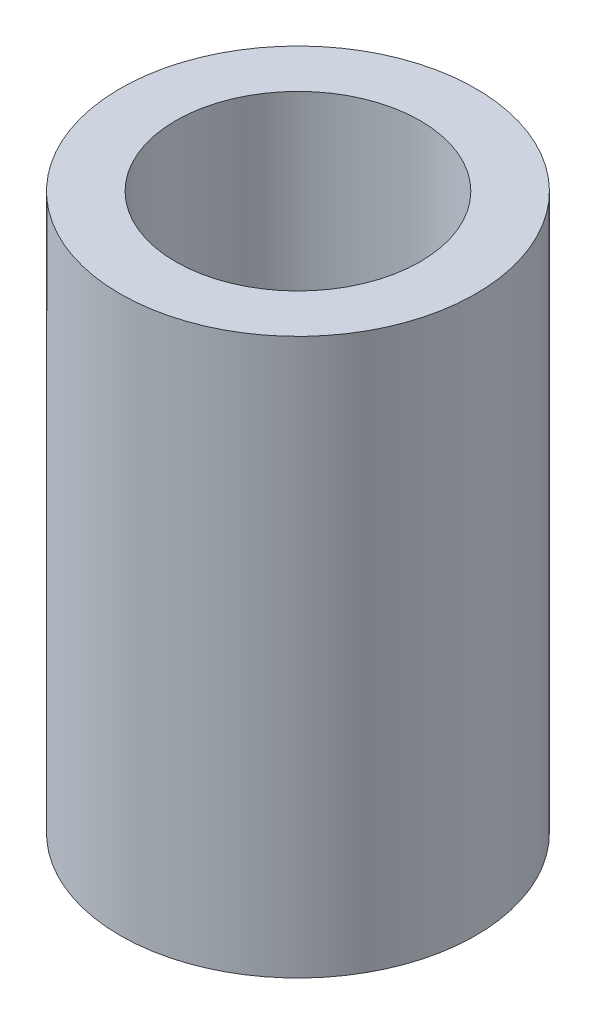
ISO-10303-21;
HEADER;
FILE_DESCRIPTION(('STEP AP214'),'2;1');
FILE_NAME('part.step','',(''),(''),'','','');
FILE_SCHEMA(('AUTOMOTIVE_DESIGN { 1 0 10303 214 1 1 1 1 }'));
ENDSEC;
DATA;
#1=APPLICATION_CONTEXT('core data for automotive mechanical design processes');
#2=APPLICATION_PROTOCOL_DEFINITION('international standard','automotive_design',2000,#1);
#3=PRODUCT_CONTEXT('',#1,'mechanical');
#4=PRODUCT('Part','Part','',(#3));
#5=PRODUCT_RELATED_PRODUCT_CATEGORY('part','',(#4));
#6=PRODUCT_DEFINITION_FORMATION('','',#4);
#7=PRODUCT_DEFINITION_CONTEXT('part definition',#1,'design');
#8=PRODUCT_DEFINITION('design','',#6,#7);
#9=PRODUCT_DEFINITION_SHAPE('','',#8);
#10=(LENGTH_UNIT() NAMED_UNIT(*) SI_UNIT(.MILLI.,.METRE.));
#11=(NAMED_UNIT(*) PLANE_ANGLE_UNIT() SI_UNIT($,.RADIAN.));
#12=(NAMED_UNIT(*) SI_UNIT($,.STERADIAN.) SOLID_ANGLE_UNIT());
#13=UNCERTAINTY_MEASURE_WITH_UNIT(LENGTH_MEASURE(1.E-05),#10,'distance_accuracy_value','');
#14=(GEOMETRIC_REPRESENTATION_CONTEXT(3) GLOBAL_UNCERTAINTY_ASSIGNED_CONTEXT((#13)) GLOBAL_UNIT_ASSIGNED_CONTEXT((#10,
#11,#12)) REPRESENTATION_CONTEXT('',''));
#15=CARTESIAN_POINT('',(0.,0.,0.));
#16=DIRECTION('',(0.,0.,1.));
#17=DIRECTION('',(1.,0.,0.));
#18=AXIS2_PLACEMENT_3D('',#15,#16,#17);
#19=CARTESIAN_POINT('',(0.,5.,0.));
#20=DIRECTION('',(0.,1.,0.));
#21=DIRECTION('',(0.,0.,1.));
#22=AXIS2_PLACEMENT_3D('',#19,#20,#21);
#23=PLANE('',#22);
#24=CARTESIAN_POINT('',(0.,5.,0.));
#25=DIRECTION('',(0.,1.,0.));
#26=DIRECTION('',(0.,0.,1.));
#27=AXIS2_PLACEMENT_3D('',#24,#25,#26);
#28=CIRCLE('',#27,1.6);
#29=CARTESIAN_POINT('',(0.,5.,1.6));
#30=VERTEX_POINT('',#29);
#31=EDGE_CURVE('E10',#30,#30,#28,.T.);
#32=ORIENTED_EDGE('',*,*,#31,.T.);
#33=EDGE_LOOP('',(#32));
#34=FACE_BOUND('',#33,.T.);
#35=CARTESIAN_POINT('',(0.,5.,0.));
#36=DIRECTION('',(0.,1.,0.));
#37=DIRECTION('',(0.,0.,1.));
#38=AXIS2_PLACEMENT_3D('',#35,#36,#37);
#39=CIRCLE('',#38,1.1);
#40=CARTESIAN_POINT('',(0.,5.,1.1));
#41=VERTEX_POINT('',#40);
#42=EDGE_CURVE('E41',#41,#41,#39,.T.);
#43=ORIENTED_EDGE('',*,*,#42,.F.);
#44=EDGE_LOOP('',(#43));
#45=FACE_BOUND('',#44,.T.);
#46=ADVANCED_FACE('F30',(#34,#45),#23,.T.);
#47=CARTESIAN_POINT('',(0.,0.,0.));
#48=DIRECTION('',(0.,1.,0.));
#49=DIRECTION('',(0.,0.,1.));
#50=AXIS2_PLACEMENT_3D('',#47,#48,#49);
#51=PLANE('',#50);
#52=CARTESIAN_POINT('',(0.,0.,0.));
#53=DIRECTION('',(0.,1.,0.));
#54=DIRECTION('',(0.,0.,1.));
#55=AXIS2_PLACEMENT_3D('',#52,#53,#54);
#56=CIRCLE('',#55,1.6);
#57=CARTESIAN_POINT('',(0.,0.,1.6));
#58=VERTEX_POINT('',#57);
#59=EDGE_CURVE('E34',#58,#58,#56,.T.);
#60=ORIENTED_EDGE('',*,*,#59,.F.);
#61=EDGE_LOOP('',(#60));
#62=FACE_BOUND('',#61,.T.);
#63=CARTESIAN_POINT('',(0.,0.,0.));
#64=DIRECTION('',(0.,1.,0.));
#65=DIRECTION('',(0.,0.,1.));
#66=AXIS2_PLACEMENT_3D('',#63,#64,#65);
#67=CIRCLE('',#66,1.1);
#68=CARTESIAN_POINT('',(0.,0.,1.1));
#69=VERTEX_POINT('',#68);
#70=EDGE_CURVE('E43',#69,#69,#67,.T.);
#71=ORIENTED_EDGE('',*,*,#70,.T.);
#72=EDGE_LOOP('',(#71));
#73=FACE_BOUND('',#72,.T.);
#74=ADVANCED_FACE('F53',(#62,#73),#51,.F.);
#75=CARTESIAN_POINT('',(0.,5.,0.));
#76=DIRECTION('',(0.,-1.,0.));
#77=DIRECTION('',(0.,0.,-1.));
#78=AXIS2_PLACEMENT_3D('',#75,#76,#77);
#79=CYLINDRICAL_SURFACE('',#78,1.6);
#80=ORIENTED_EDGE('',*,*,#31,.F.);
#81=EDGE_LOOP('',(#80));
#82=FACE_BOUND('',#81,.T.);
#83=ORIENTED_EDGE('',*,*,#59,.T.);
#84=EDGE_LOOP('',(#83));
#85=FACE_BOUND('',#84,.T.);
#86=ADVANCED_FACE('F32',(#82,#85),#79,.T.);
#87=CARTESIAN_POINT('',(0.,5.,0.));
#88=DIRECTION('',(0.,-1.,0.));
#89=DIRECTION('',(0.,0.,-1.));
#90=AXIS2_PLACEMENT_3D('',#87,#88,#89);
#91=CYLINDRICAL_SURFACE('',#90,1.1);
#92=ORIENTED_EDGE('',*,*,#42,.T.);
#93=EDGE_LOOP('',(#92));
#94=FACE_BOUND('',#93,.T.);
#95=ORIENTED_EDGE('',*,*,#70,.F.);
#96=EDGE_LOOP('',(#95));
#97=FACE_BOUND('',#96,.T.);
#98=ADVANCED_FACE('F49',(#94,#97),#91,.F.);
#99=CLOSED_SHELL('',(#46,#74,#86,#98));
#100=MANIFOLD_SOLID_BREP('B2',#99);
#101=ADVANCED_BREP_SHAPE_REPRESENTATION('',(#18,#100),#14);
#102=SHAPE_DEFINITION_REPRESENTATION(#9,#101);
ENDSEC;
END-ISO-10303-21;
